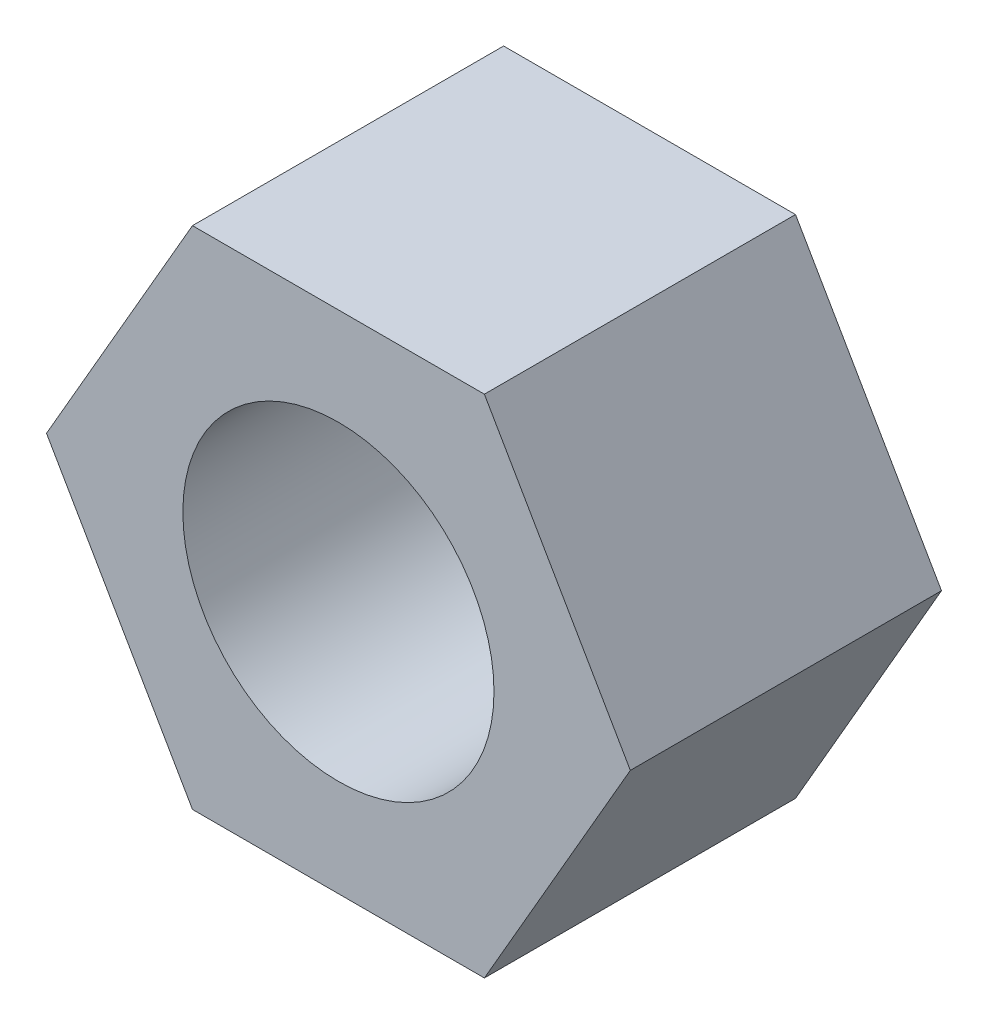
ISO-10303-21;
HEADER;
FILE_DESCRIPTION(('STEP AP214'),'2;1');
FILE_NAME('part.step','',(''),(''),'','','');
FILE_SCHEMA(('AUTOMOTIVE_DESIGN { 1 0 10303 214 1 1 1 1 }'));
ENDSEC;
DATA;
#1=APPLICATION_CONTEXT('core data for automotive mechanical design processes');
#2=APPLICATION_PROTOCOL_DEFINITION('international standard','automotive_design',2000,#1);
#3=PRODUCT_CONTEXT('',#1,'mechanical');
#4=PRODUCT('Part','Part','',(#3));
#5=PRODUCT_RELATED_PRODUCT_CATEGORY('part','',(#4));
#6=PRODUCT_DEFINITION_FORMATION('','',#4);
#7=PRODUCT_DEFINITION_CONTEXT('part definition',#1,'design');
#8=PRODUCT_DEFINITION('design','',#6,#7);
#9=PRODUCT_DEFINITION_SHAPE('','',#8);
#10=(LENGTH_UNIT() NAMED_UNIT(*) SI_UNIT(.MILLI.,.METRE.));
#11=(NAMED_UNIT(*) PLANE_ANGLE_UNIT() SI_UNIT($,.RADIAN.));
#12=(NAMED_UNIT(*) SI_UNIT($,.STERADIAN.) SOLID_ANGLE_UNIT());
#13=UNCERTAINTY_MEASURE_WITH_UNIT(LENGTH_MEASURE(1.E-05),#10,'distance_accuracy_value','');
#14=(GEOMETRIC_REPRESENTATION_CONTEXT(3) GLOBAL_UNCERTAINTY_ASSIGNED_CONTEXT((#13)) GLOBAL_UNIT_ASSIGNED_CONTEXT((#10,
#11,#12)) REPRESENTATION_CONTEXT('',''));
#15=CARTESIAN_POINT('',(0.,0.,0.));
#16=DIRECTION('',(0.,0.,1.));
#17=DIRECTION('',(1.,0.,0.));
#18=AXIS2_PLACEMENT_3D('',#15,#16,#17);
#19=CARTESIAN_POINT('',(0.,0.,8.));
#20=DIRECTION('',(0.,0.,1.));
#21=DIRECTION('',(1.,0.,0.));
#22=AXIS2_PLACEMENT_3D('',#19,#20,#21);
#23=PLANE('',#22);
#24=DIRECTION('',(-1.,0.,0.));
#25=VECTOR('',#24,1.);
#26=CARTESIAN_POINT('',(3.75277674973257,6.5,8.));
#27=LINE('',#26,#25);
#28=CARTESIAN_POINT('',(3.75277674973257,6.5,8.));
#29=VERTEX_POINT('',#28);
#30=CARTESIAN_POINT('',(-3.75277674973257,6.5,8.));
#31=VERTEX_POINT('',#30);
#32=EDGE_CURVE('E131',#29,#31,#27,.T.);
#33=ORIENTED_EDGE('',*,*,#32,.T.);
#34=DIRECTION('',(-0.5,-0.866025403784439,0.));
#35=VECTOR('',#34,1.);
#36=CARTESIAN_POINT('',(-3.75277674973257,6.5,8.));
#37=LINE('',#36,#35);
#38=CARTESIAN_POINT('',(-7.50555349946513,0.,8.));
#39=VERTEX_POINT('',#38);
#40=EDGE_CURVE('E89',#31,#39,#37,.T.);
#41=ORIENTED_EDGE('',*,*,#40,.T.);
#42=DIRECTION('',(0.5,-0.866025403784439,0.));
#43=VECTOR('',#42,1.);
#44=CARTESIAN_POINT('',(-7.50555349946513,0.,8.));
#45=LINE('',#44,#43);
#46=CARTESIAN_POINT('',(-3.75277674973256,-6.5,8.));
#47=VERTEX_POINT('',#46);
#48=EDGE_CURVE('E102',#39,#47,#45,.T.);
#49=ORIENTED_EDGE('',*,*,#48,.T.);
#50=DIRECTION('',(1.,0.,0.));
#51=VECTOR('',#50,1.);
#52=CARTESIAN_POINT('',(-3.75277674973256,-6.5,8.));
#53=LINE('',#52,#51);
#54=CARTESIAN_POINT('',(3.75277674973257,-6.5,8.));
#55=VERTEX_POINT('',#54);
#56=EDGE_CURVE('E96',#47,#55,#53,.T.);
#57=ORIENTED_EDGE('',*,*,#56,.T.);
#58=DIRECTION('',(0.5,0.866025403784439,0.));
#59=VECTOR('',#58,1.);
#60=CARTESIAN_POINT('',(3.75277674973257,-6.5,8.));
#61=LINE('',#60,#59);
#62=CARTESIAN_POINT('',(7.50555349946513,0.,8.));
#63=VERTEX_POINT('',#62);
#64=EDGE_CURVE('E100',#55,#63,#61,.T.);
#65=ORIENTED_EDGE('',*,*,#64,.T.);
#66=DIRECTION('',(-0.5,0.866025403784439,0.));
#67=VECTOR('',#66,1.);
#68=CARTESIAN_POINT('',(7.50555349946513,0.,8.));
#69=LINE('',#68,#67);
#70=EDGE_CURVE('E52',#63,#29,#69,.T.);
#71=ORIENTED_EDGE('',*,*,#70,.T.);
#72=EDGE_LOOP('',(#33,#41,#49,#57,#65,#71));
#73=FACE_BOUND('',#72,.T.);
#74=CARTESIAN_POINT('',(0.,0.,8.));
#75=DIRECTION('',(0.,0.,1.));
#76=DIRECTION('',(1.,0.,0.));
#77=AXIS2_PLACEMENT_3D('',#74,#75,#76);
#78=CIRCLE('',#77,4.);
#79=CARTESIAN_POINT('',(4.,0.,8.));
#80=VERTEX_POINT('',#79);
#81=EDGE_CURVE('E124',#80,#80,#78,.T.);
#82=ORIENTED_EDGE('',*,*,#81,.F.);
#83=EDGE_LOOP('',(#82));
#84=FACE_BOUND('',#83,.T.);
#85=ADVANCED_FACE('F35',(#73,#84),#23,.T.);
#86=CARTESIAN_POINT('',(0.,0.,0.));
#87=DIRECTION('',(0.,0.,1.));
#88=DIRECTION('',(1.,0.,0.));
#89=AXIS2_PLACEMENT_3D('',#86,#87,#88);
#90=PLANE('',#89);
#91=DIRECTION('',(-1.,0.,0.));
#92=VECTOR('',#91,1.);
#93=CARTESIAN_POINT('',(3.75277674973257,6.5,0.));
#94=LINE('',#93,#92);
#95=CARTESIAN_POINT('',(3.75277674973257,6.5,0.));
#96=VERTEX_POINT('',#95);
#97=CARTESIAN_POINT('',(-3.75277674973257,6.5,0.));
#98=VERTEX_POINT('',#97);
#99=EDGE_CURVE('E120',#96,#98,#94,.T.);
#100=ORIENTED_EDGE('',*,*,#99,.F.);
#101=DIRECTION('',(-0.5,0.866025403784439,0.));
#102=VECTOR('',#101,1.);
#103=CARTESIAN_POINT('',(7.50555349946513,0.,0.));
#104=LINE('',#103,#102);
#105=CARTESIAN_POINT('',(7.50555349946513,0.,0.));
#106=VERTEX_POINT('',#105);
#107=EDGE_CURVE('E81',#106,#96,#104,.T.);
#108=ORIENTED_EDGE('',*,*,#107,.F.);
#109=DIRECTION('',(0.5,0.866025403784439,0.));
#110=VECTOR('',#109,1.);
#111=CARTESIAN_POINT('',(3.75277674973257,-6.5,0.));
#112=LINE('',#111,#110);
#113=CARTESIAN_POINT('',(3.75277674973257,-6.5,0.));
#114=VERTEX_POINT('',#113);
#115=EDGE_CURVE('E75',#114,#106,#112,.T.);
#116=ORIENTED_EDGE('',*,*,#115,.F.);
#117=DIRECTION('',(1.,0.,0.));
#118=VECTOR('',#117,1.);
#119=CARTESIAN_POINT('',(-3.75277674973256,-6.5,0.));
#120=LINE('',#119,#118);
#121=CARTESIAN_POINT('',(-3.75277674973256,-6.5,0.));
#122=VERTEX_POINT('',#121);
#123=EDGE_CURVE('E110',#122,#114,#120,.T.);
#124=ORIENTED_EDGE('',*,*,#123,.F.);
#125=DIRECTION('',(0.5,-0.866025403784439,0.));
#126=VECTOR('',#125,1.);
#127=CARTESIAN_POINT('',(-7.50555349946513,0.,0.));
#128=LINE('',#127,#126);
#129=CARTESIAN_POINT('',(-7.50555349946513,0.,0.));
#130=VERTEX_POINT('',#129);
#131=EDGE_CURVE('E126',#130,#122,#128,.T.);
#132=ORIENTED_EDGE('',*,*,#131,.F.);
#133=DIRECTION('',(-0.5,-0.866025403784439,0.));
#134=VECTOR('',#133,1.);
#135=CARTESIAN_POINT('',(-3.75277674973257,6.5,0.));
#136=LINE('',#135,#134);
#137=EDGE_CURVE('E123',#98,#130,#136,.T.);
#138=ORIENTED_EDGE('',*,*,#137,.F.);
#139=EDGE_LOOP('',(#100,#108,#116,#124,#132,#138));
#140=FACE_BOUND('',#139,.T.);
#141=CARTESIAN_POINT('',(0.,0.,0.));
#142=DIRECTION('',(0.,0.,1.));
#143=DIRECTION('',(1.,0.,0.));
#144=AXIS2_PLACEMENT_3D('',#141,#142,#143);
#145=CIRCLE('',#144,4.);
#146=CARTESIAN_POINT('',(4.,0.,0.));
#147=VERTEX_POINT('',#146);
#148=EDGE_CURVE('E224',#147,#147,#145,.T.);
#149=ORIENTED_EDGE('',*,*,#148,.T.);
#150=EDGE_LOOP('',(#149));
#151=FACE_BOUND('',#150,.T.);
#152=ADVANCED_FACE('F140',(#140,#151),#90,.F.);
#153=CARTESIAN_POINT('',(3.75277674973257,6.5,8.));
#154=DIRECTION('',(0.,-1.,0.));
#155=DIRECTION('',(1.,0.,0.));
#156=AXIS2_PLACEMENT_3D('',#153,#154,#155);
#157=PLANE('',#156);
#158=ORIENTED_EDGE('',*,*,#99,.T.);
#159=DIRECTION('',(0.,0.,-1.));
#160=VECTOR('',#159,1.);
#161=CARTESIAN_POINT('',(-3.75277674973257,6.5,8.));
#162=LINE('',#161,#160);
#163=EDGE_CURVE('E11',#31,#98,#162,.T.);
#164=ORIENTED_EDGE('',*,*,#163,.F.);
#165=ORIENTED_EDGE('',*,*,#32,.F.);
#166=DIRECTION('',(0.,0.,-1.));
#167=VECTOR('',#166,1.);
#168=CARTESIAN_POINT('',(3.75277674973257,6.5,8.));
#169=LINE('',#168,#167);
#170=EDGE_CURVE('E116',#29,#96,#169,.T.);
#171=ORIENTED_EDGE('',*,*,#170,.T.);
#172=EDGE_LOOP('',(#158,#164,#165,#171));
#173=FACE_BOUND('',#172,.T.);
#174=ADVANCED_FACE('F37',(#173),#157,.F.);
#175=CARTESIAN_POINT('',(-3.75277674973257,6.5,8.));
#176=DIRECTION('',(0.866025403784439,-0.5,0.));
#177=DIRECTION('',(0.5,0.866025403784439,0.));
#178=AXIS2_PLACEMENT_3D('',#175,#176,#177);
#179=PLANE('',#178);
#180=ORIENTED_EDGE('',*,*,#137,.T.);
#181=DIRECTION('',(0.,0.,-1.));
#182=VECTOR('',#181,1.);
#183=CARTESIAN_POINT('',(-7.50555349946513,0.,8.));
#184=LINE('',#183,#182);
#185=EDGE_CURVE('E44',#39,#130,#184,.T.);
#186=ORIENTED_EDGE('',*,*,#185,.F.);
#187=ORIENTED_EDGE('',*,*,#40,.F.);
#188=ORIENTED_EDGE('',*,*,#163,.T.);
#189=EDGE_LOOP('',(#180,#186,#187,#188));
#190=FACE_BOUND('',#189,.T.);
#191=ADVANCED_FACE('F165',(#190),#179,.F.);
#192=CARTESIAN_POINT('',(-7.50555349946513,0.,8.));
#193=DIRECTION('',(0.866025403784439,0.5,0.));
#194=DIRECTION('',(-0.5,0.866025403784439,0.));
#195=AXIS2_PLACEMENT_3D('',#192,#193,#194);
#196=PLANE('',#195);
#197=ORIENTED_EDGE('',*,*,#131,.T.);
#198=DIRECTION('',(0.,0.,-1.));
#199=VECTOR('',#198,1.);
#200=CARTESIAN_POINT('',(-3.75277674973256,-6.5,8.));
#201=LINE('',#200,#199);
#202=EDGE_CURVE('E111',#47,#122,#201,.T.);
#203=ORIENTED_EDGE('',*,*,#202,.F.);
#204=ORIENTED_EDGE('',*,*,#48,.F.);
#205=ORIENTED_EDGE('',*,*,#185,.T.);
#206=EDGE_LOOP('',(#197,#203,#204,#205));
#207=FACE_BOUND('',#206,.T.);
#208=ADVANCED_FACE('F137',(#207),#196,.F.);
#209=CARTESIAN_POINT('',(-3.75277674973256,-6.5,8.));
#210=DIRECTION('',(0.,1.,0.));
#211=DIRECTION('',(-1.,0.,0.));
#212=AXIS2_PLACEMENT_3D('',#209,#210,#211);
#213=PLANE('',#212);
#214=ORIENTED_EDGE('',*,*,#123,.T.);
#215=DIRECTION('',(0.,0.,-1.));
#216=VECTOR('',#215,1.);
#217=CARTESIAN_POINT('',(3.75277674973257,-6.5,8.));
#218=LINE('',#217,#216);
#219=EDGE_CURVE('E107',#55,#114,#218,.T.);
#220=ORIENTED_EDGE('',*,*,#219,.F.);
#221=ORIENTED_EDGE('',*,*,#56,.F.);
#222=ORIENTED_EDGE('',*,*,#202,.T.);
#223=EDGE_LOOP('',(#214,#220,#221,#222));
#224=FACE_BOUND('',#223,.T.);
#225=ADVANCED_FACE('F108',(#224),#213,.F.);
#226=CARTESIAN_POINT('',(3.75277674973257,-6.5,8.));
#227=DIRECTION('',(-0.866025403784439,0.5,0.));
#228=DIRECTION('',(-0.5,-0.866025403784439,0.));
#229=AXIS2_PLACEMENT_3D('',#226,#227,#228);
#230=PLANE('',#229);
#231=ORIENTED_EDGE('',*,*,#115,.T.);
#232=DIRECTION('',(0.,0.,-1.));
#233=VECTOR('',#232,1.);
#234=CARTESIAN_POINT('',(7.50555349946513,0.,8.));
#235=LINE('',#234,#233);
#236=EDGE_CURVE('E112',#63,#106,#235,.T.);
#237=ORIENTED_EDGE('',*,*,#236,.F.);
#238=ORIENTED_EDGE('',*,*,#64,.F.);
#239=ORIENTED_EDGE('',*,*,#219,.T.);
#240=EDGE_LOOP('',(#231,#237,#238,#239));
#241=FACE_BOUND('',#240,.T.);
#242=ADVANCED_FACE('F114',(#241),#230,.F.);
#243=CARTESIAN_POINT('',(7.50555349946513,0.,8.));
#244=DIRECTION('',(-0.866025403784439,-0.5,0.));
#245=DIRECTION('',(0.5,-0.866025403784439,0.));
#246=AXIS2_PLACEMENT_3D('',#243,#244,#245);
#247=PLANE('',#246);
#248=ORIENTED_EDGE('',*,*,#107,.T.);
#249=ORIENTED_EDGE('',*,*,#170,.F.);
#250=ORIENTED_EDGE('',*,*,#70,.F.);
#251=ORIENTED_EDGE('',*,*,#236,.T.);
#252=EDGE_LOOP('',(#248,#249,#250,#251));
#253=FACE_BOUND('',#252,.T.);
#254=ADVANCED_FACE('F145',(#253),#247,.F.);
#255=CARTESIAN_POINT('',(0.,0.,8.));
#256=DIRECTION('',(0.,0.,-1.));
#257=DIRECTION('',(-1.,0.,0.));
#258=AXIS2_PLACEMENT_3D('',#255,#256,#257);
#259=CYLINDRICAL_SURFACE('',#258,4.);
#260=ORIENTED_EDGE('',*,*,#81,.T.);
#261=EDGE_LOOP('',(#260));
#262=FACE_BOUND('',#261,.T.);
#263=ORIENTED_EDGE('',*,*,#148,.F.);
#264=EDGE_LOOP('',(#263));
#265=FACE_BOUND('',#264,.T.);
#266=ADVANCED_FACE('F147',(#262,#265),#259,.F.);
#267=CLOSED_SHELL('',(#85,#152,#174,#191,#208,#225,#242,#254,#266));
#268=MANIFOLD_SOLID_BREP('B2',#267);
#269=ADVANCED_BREP_SHAPE_REPRESENTATION('',(#18,#268),#14);
#270=SHAPE_DEFINITION_REPRESENTATION(#9,#269);
ENDSEC;
END-ISO-10303-21;
